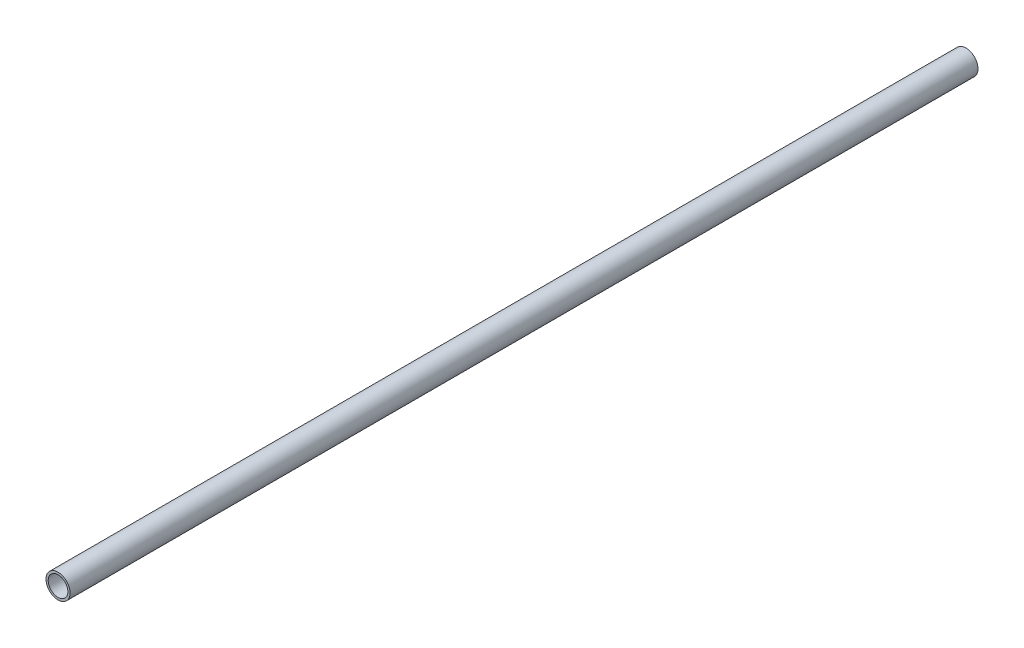
ISO-10303-21;
HEADER;
FILE_DESCRIPTION(('STEP AP214'),'2;1');
FILE_NAME('part.step','',(''),(''),'','','');
FILE_SCHEMA(('AUTOMOTIVE_DESIGN { 1 0 10303 214 1 1 1 1 }'));
ENDSEC;
DATA;
#1=APPLICATION_CONTEXT('core data for automotive mechanical design processes');
#2=APPLICATION_PROTOCOL_DEFINITION('international standard','automotive_design',2000,#1);
#3=PRODUCT_CONTEXT('',#1,'mechanical');
#4=PRODUCT('Part','Part','',(#3));
#5=PRODUCT_RELATED_PRODUCT_CATEGORY('part','',(#4));
#6=PRODUCT_DEFINITION_FORMATION('','',#4);
#7=PRODUCT_DEFINITION_CONTEXT('part definition',#1,'design');
#8=PRODUCT_DEFINITION('design','',#6,#7);
#9=PRODUCT_DEFINITION_SHAPE('','',#8);
#10=(LENGTH_UNIT() NAMED_UNIT(*) SI_UNIT(.MILLI.,.METRE.));
#11=(NAMED_UNIT(*) PLANE_ANGLE_UNIT() SI_UNIT($,.RADIAN.));
#12=(NAMED_UNIT(*) SI_UNIT($,.STERADIAN.) SOLID_ANGLE_UNIT());
#13=UNCERTAINTY_MEASURE_WITH_UNIT(LENGTH_MEASURE(1.E-05),#10,'distance_accuracy_value','');
#14=(GEOMETRIC_REPRESENTATION_CONTEXT(3) GLOBAL_UNCERTAINTY_ASSIGNED_CONTEXT((#13)) GLOBAL_UNIT_ASSIGNED_CONTEXT((#10,
#11,#12)) REPRESENTATION_CONTEXT('',''));
#15=CARTESIAN_POINT('',(0.,0.,0.));
#16=DIRECTION('',(0.,0.,1.));
#17=DIRECTION('',(1.,0.,0.));
#18=AXIS2_PLACEMENT_3D('',#15,#16,#17);
#19=CARTESIAN_POINT('',(0.,0.,152.5));
#20=DIRECTION('',(0.,0.,-1.));
#21=DIRECTION('',(-1.,0.,0.));
#22=AXIS2_PLACEMENT_3D('',#19,#20,#21);
#23=CYLINDRICAL_SURFACE('',#22,4.05);
#24=CARTESIAN_POINT('',(0.,0.,152.5));
#25=DIRECTION('',(0.,0.,1.));
#26=DIRECTION('',(1.,0.,0.));
#27=AXIS2_PLACEMENT_3D('',#24,#25,#26);
#28=CIRCLE('',#27,4.05);
#29=CARTESIAN_POINT('',(4.05,0.,152.5));
#30=VERTEX_POINT('',#29);
#31=EDGE_CURVE('E10',#30,#30,#28,.T.);
#32=ORIENTED_EDGE('',*,*,#31,.F.);
#33=EDGE_LOOP('',(#32));
#34=FACE_BOUND('',#33,.T.);
#35=CARTESIAN_POINT('',(0.,0.,-152.5));
#36=DIRECTION('',(0.,0.,1.));
#37=DIRECTION('',(1.,0.,0.));
#38=AXIS2_PLACEMENT_3D('',#35,#36,#37);
#39=CIRCLE('',#38,4.05);
#40=CARTESIAN_POINT('',(4.05,0.,-152.5));
#41=VERTEX_POINT('',#40);
#42=EDGE_CURVE('E37',#41,#41,#39,.T.);
#43=ORIENTED_EDGE('',*,*,#42,.T.);
#44=EDGE_LOOP('',(#43));
#45=FACE_BOUND('',#44,.T.);
#46=ADVANCED_FACE('F34',(#34,#45),#23,.T.);
#47=CARTESIAN_POINT('',(0.,0.,152.5));
#48=DIRECTION('',(0.,0.,1.));
#49=DIRECTION('',(1.,0.,0.));
#50=AXIS2_PLACEMENT_3D('',#47,#48,#49);
#51=PLANE('',#50);
#52=CARTESIAN_POINT('',(0.,0.,152.5));
#53=DIRECTION('',(0.,0.,1.));
#54=DIRECTION('',(1.,0.,0.));
#55=AXIS2_PLACEMENT_3D('',#52,#53,#54);
#56=CIRCLE('',#55,3.3);
#57=CARTESIAN_POINT('',(3.3,0.,152.5));
#58=VERTEX_POINT('',#57);
#59=EDGE_CURVE('E46',#58,#58,#56,.T.);
#60=ORIENTED_EDGE('',*,*,#59,.F.);
#61=EDGE_LOOP('',(#60));
#62=FACE_BOUND('',#61,.T.);
#63=ORIENTED_EDGE('',*,*,#31,.T.);
#64=EDGE_LOOP('',(#63));
#65=FACE_BOUND('',#64,.T.);
#66=ADVANCED_FACE('F70',(#62,#65),#51,.T.);
#67=CARTESIAN_POINT('',(0.,0.,-152.5));
#68=DIRECTION('',(0.,0.,1.));
#69=DIRECTION('',(1.,0.,0.));
#70=AXIS2_PLACEMENT_3D('',#67,#68,#69);
#71=PLANE('',#70);
#72=CARTESIAN_POINT('',(0.,0.,-152.5));
#73=DIRECTION('',(0.,0.,1.));
#74=DIRECTION('',(1.,0.,0.));
#75=AXIS2_PLACEMENT_3D('',#72,#73,#74);
#76=CIRCLE('',#75,3.3);
#77=CARTESIAN_POINT('',(3.3,0.,-152.5));
#78=VERTEX_POINT('',#77);
#79=EDGE_CURVE('E52',#78,#78,#76,.T.);
#80=ORIENTED_EDGE('',*,*,#79,.T.);
#81=EDGE_LOOP('',(#80));
#82=FACE_BOUND('',#81,.T.);
#83=ORIENTED_EDGE('',*,*,#42,.F.);
#84=EDGE_LOOP('',(#83));
#85=FACE_BOUND('',#84,.T.);
#86=ADVANCED_FACE('F75',(#82,#85),#71,.F.);
#87=CARTESIAN_POINT('',(0.,0.,132.5));
#88=DIRECTION('',(0.,0.,1.));
#89=DIRECTION('',(1.,0.,0.));
#90=AXIS2_PLACEMENT_3D('',#87,#88,#89);
#91=CYLINDRICAL_SURFACE('',#90,3.3);
#92=CARTESIAN_POINT('',(0.,0.,132.5));
#93=DIRECTION('',(0.,0.,1.));
#94=DIRECTION('',(1.,0.,0.));
#95=AXIS2_PLACEMENT_3D('',#92,#93,#94);
#96=CIRCLE('',#95,3.3);
#97=CARTESIAN_POINT('',(3.3,0.,132.5));
#98=VERTEX_POINT('',#97);
#99=EDGE_CURVE('E44',#98,#98,#96,.T.);
#100=ORIENTED_EDGE('',*,*,#99,.F.);
#101=EDGE_LOOP('',(#100));
#102=FACE_BOUND('',#101,.T.);
#103=ORIENTED_EDGE('',*,*,#59,.T.);
#104=EDGE_LOOP('',(#103));
#105=FACE_BOUND('',#104,.T.);
#106=ADVANCED_FACE('F82',(#102,#105),#91,.F.);
#107=CARTESIAN_POINT('',(0.,0.,132.5));
#108=DIRECTION('',(0.,0.,1.));
#109=DIRECTION('',(1.,0.,0.));
#110=AXIS2_PLACEMENT_3D('',#107,#108,#109);
#111=PLANE('',#110);
#112=ORIENTED_EDGE('',*,*,#99,.T.);
#113=EDGE_LOOP('',(#112));
#114=FACE_BOUND('',#113,.T.);
#115=ADVANCED_FACE('F67',(#114),#111,.T.);
#116=CARTESIAN_POINT('',(0.,0.,-132.5));
#117=DIRECTION('',(0.,0.,-1.));
#118=DIRECTION('',(-1.,0.,0.));
#119=AXIS2_PLACEMENT_3D('',#116,#117,#118);
#120=CYLINDRICAL_SURFACE('',#119,3.3);
#121=CARTESIAN_POINT('',(0.,0.,-132.5));
#122=DIRECTION('',(0.,0.,1.));
#123=DIRECTION('',(1.,0.,0.));
#124=AXIS2_PLACEMENT_3D('',#121,#122,#123);
#125=CIRCLE('',#124,3.3);
#126=CARTESIAN_POINT('',(3.3,0.,-132.5));
#127=VERTEX_POINT('',#126);
#128=EDGE_CURVE('E49',#127,#127,#125,.T.);
#129=ORIENTED_EDGE('',*,*,#128,.T.);
#130=EDGE_LOOP('',(#129));
#131=FACE_BOUND('',#130,.T.);
#132=ORIENTED_EDGE('',*,*,#79,.F.);
#133=EDGE_LOOP('',(#132));
#134=FACE_BOUND('',#133,.T.);
#135=ADVANCED_FACE('F58',(#131,#134),#120,.F.);
#136=CARTESIAN_POINT('',(0.,0.,-132.5));
#137=DIRECTION('',(0.,0.,-1.));
#138=DIRECTION('',(1.,0.,0.));
#139=AXIS2_PLACEMENT_3D('',#136,#137,#138);
#140=PLANE('',#139);
#141=ORIENTED_EDGE('',*,*,#128,.F.);
#142=EDGE_LOOP('',(#141));
#143=FACE_BOUND('',#142,.T.);
#144=ADVANCED_FACE('F61',(#143),#140,.T.);
#145=CLOSED_SHELL('',(#46,#66,#86,#106,#115,#135,#144));
#146=MANIFOLD_SOLID_BREP('B2',#145);
#147=ADVANCED_BREP_SHAPE_REPRESENTATION('',(#18,#146),#14);
#148=SHAPE_DEFINITION_REPRESENTATION(#9,#147);
ENDSEC;
END-ISO-10303-21;
